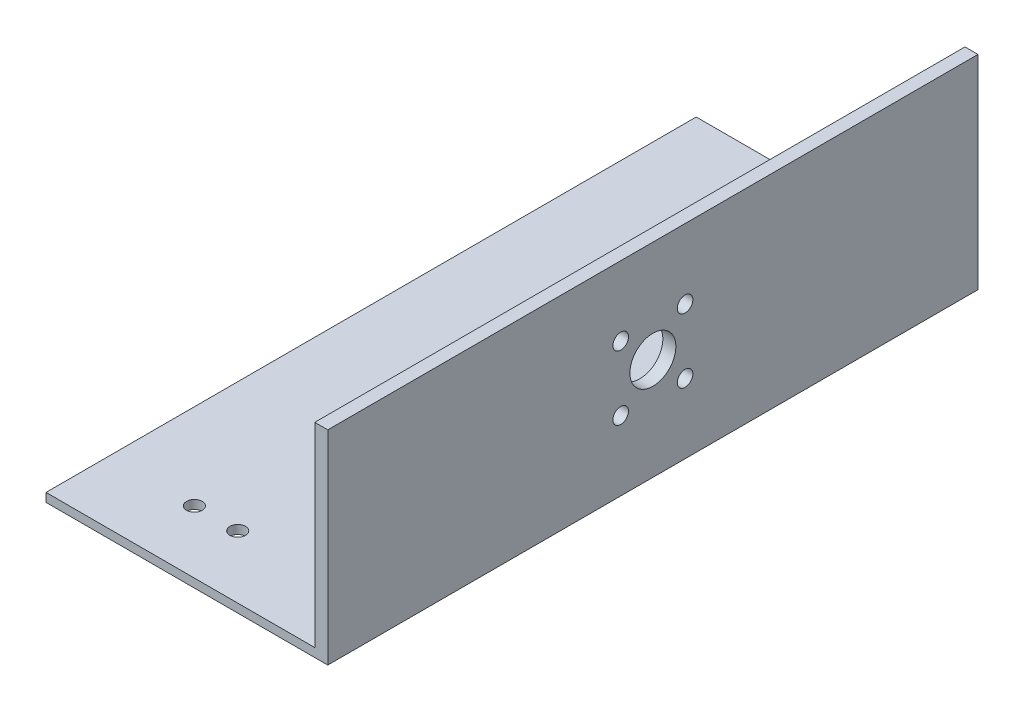
ISO-10303-21;
HEADER;
FILE_DESCRIPTION(('STEP AP214'),'2;1');
FILE_NAME('part.step','',(''),(''),'','','');
FILE_SCHEMA(('AUTOMOTIVE_DESIGN { 1 0 10303 214 1 1 1 1 }'));
ENDSEC;
DATA;
#1=APPLICATION_CONTEXT('core data for automotive mechanical design processes');
#2=APPLICATION_PROTOCOL_DEFINITION('international standard','automotive_design',2000,#1);
#3=PRODUCT_CONTEXT('',#1,'mechanical');
#4=PRODUCT('Part','Part','',(#3));
#5=PRODUCT_RELATED_PRODUCT_CATEGORY('part','',(#4));
#6=PRODUCT_DEFINITION_FORMATION('','',#4);
#7=PRODUCT_DEFINITION_CONTEXT('part definition',#1,'design');
#8=PRODUCT_DEFINITION('design','',#6,#7);
#9=PRODUCT_DEFINITION_SHAPE('','',#8);
#10=(LENGTH_UNIT() NAMED_UNIT(*) SI_UNIT(.MILLI.,.METRE.));
#11=(NAMED_UNIT(*) PLANE_ANGLE_UNIT() SI_UNIT($,.RADIAN.));
#12=(NAMED_UNIT(*) SI_UNIT($,.STERADIAN.) SOLID_ANGLE_UNIT());
#13=UNCERTAINTY_MEASURE_WITH_UNIT(LENGTH_MEASURE(1.E-05),#10,'distance_accuracy_value','');
#14=(GEOMETRIC_REPRESENTATION_CONTEXT(3) GLOBAL_UNCERTAINTY_ASSIGNED_CONTEXT((#13)) GLOBAL_UNIT_ASSIGNED_CONTEXT((#10,
#11,#12)) REPRESENTATION_CONTEXT('',''));
#15=CARTESIAN_POINT('',(0.,0.,0.));
#16=DIRECTION('',(0.,0.,1.));
#17=DIRECTION('',(1.,0.,0.));
#18=AXIS2_PLACEMENT_3D('',#15,#16,#17);
#19=CARTESIAN_POINT('',(0.,2.,0.));
#20=DIRECTION('',(0.,-1.,0.));
#21=DIRECTION('',(0.,0.,-1.));
#22=AXIS2_PLACEMENT_3D('',#19,#20,#21);
#23=PLANE('',#22);
#24=CARTESIAN_POINT('',(-2.69999999999999,2.,12.25));
#25=DIRECTION('',(0.,1.,0.));
#26=DIRECTION('',(0.,0.,-1.));
#27=AXIS2_PLACEMENT_3D('',#24,#25,#26);
#28=CIRCLE('',#27,1.8);
#29=CARTESIAN_POINT('',(-2.69999999999999,2.,10.45));
#30=VERTEX_POINT('',#29);
#31=EDGE_CURVE('E153',#30,#30,#28,.T.);
#32=ORIENTED_EDGE('',*,*,#31,.F.);
#33=EDGE_LOOP('',(#32));
#34=FACE_BOUND('',#33,.T.);
#35=CARTESIAN_POINT('',(-12.7,2.,-60.57));
#36=DIRECTION('',(0.,1.,0.));
#37=DIRECTION('',(0.,0.,1.));
#38=AXIS2_PLACEMENT_3D('',#35,#36,#37);
#39=CIRCLE('',#38,1.8);
#40=CARTESIAN_POINT('',(-12.7,2.,-58.77));
#41=VERTEX_POINT('',#40);
#42=EDGE_CURVE('E141',#41,#41,#39,.T.);
#43=ORIENTED_EDGE('',*,*,#42,.F.);
#44=EDGE_LOOP('',(#43));
#45=FACE_BOUND('',#44,.T.);
#46=CARTESIAN_POINT('',(-12.7,2.,-12.25));
#47=DIRECTION('',(0.,1.,0.));
#48=DIRECTION('',(0.,0.,1.));
#49=AXIS2_PLACEMENT_3D('',#46,#47,#48);
#50=CIRCLE('',#49,1.8);
#51=CARTESIAN_POINT('',(-12.7,2.,-10.45));
#52=VERTEX_POINT('',#51);
#53=EDGE_CURVE('E129',#52,#52,#50,.T.);
#54=ORIENTED_EDGE('',*,*,#53,.F.);
#55=EDGE_LOOP('',(#54));
#56=FACE_BOUND('',#55,.T.);
#57=CARTESIAN_POINT('',(-2.69999999999999,2.,-60.57));
#58=DIRECTION('',(0.,1.,0.));
#59=DIRECTION('',(0.,0.,1.));
#60=AXIS2_PLACEMENT_3D('',#57,#58,#59);
#61=CIRCLE('',#60,1.8);
#62=CARTESIAN_POINT('',(-2.69999999999999,2.,-58.77));
#63=VERTEX_POINT('',#62);
#64=EDGE_CURVE('E118',#63,#63,#61,.T.);
#65=ORIENTED_EDGE('',*,*,#64,.F.);
#66=EDGE_LOOP('',(#65));
#67=FACE_BOUND('',#66,.T.);
#68=CARTESIAN_POINT('',(-2.69999999999999,2.,-12.25));
#69=DIRECTION('',(0.,1.,0.));
#70=DIRECTION('',(0.,0.,1.));
#71=AXIS2_PLACEMENT_3D('',#68,#69,#70);
#72=CIRCLE('',#71,1.8);
#73=CARTESIAN_POINT('',(-2.69999999999999,2.,-10.45));
#74=VERTEX_POINT('',#73);
#75=EDGE_CURVE('E97',#74,#74,#72,.T.);
#76=ORIENTED_EDGE('',*,*,#75,.F.);
#77=EDGE_LOOP('',(#76));
#78=FACE_BOUND('',#77,.T.);
#79=CARTESIAN_POINT('',(-12.7,2.,60.57));
#80=DIRECTION('',(0.,1.,0.));
#81=DIRECTION('',(0.,0.,-1.));
#82=AXIS2_PLACEMENT_3D('',#79,#80,#81);
#83=CIRCLE('',#82,1.8);
#84=CARTESIAN_POINT('',(-12.7,2.,58.77));
#85=VERTEX_POINT('',#84);
#86=EDGE_CURVE('E123',#85,#85,#83,.T.);
#87=ORIENTED_EDGE('',*,*,#86,.F.);
#88=EDGE_LOOP('',(#87));
#89=FACE_BOUND('',#88,.T.);
#90=CARTESIAN_POINT('',(-2.70000000000002,2.,60.57));
#91=DIRECTION('',(0.,1.,0.));
#92=DIRECTION('',(0.,0.,-1.));
#93=AXIS2_PLACEMENT_3D('',#90,#91,#92);
#94=CIRCLE('',#93,1.8);
#95=CARTESIAN_POINT('',(-2.70000000000002,2.,58.77));
#96=VERTEX_POINT('',#95);
#97=EDGE_CURVE('E135',#96,#96,#94,.T.);
#98=ORIENTED_EDGE('',*,*,#97,.F.);
#99=EDGE_LOOP('',(#98));
#100=FACE_BOUND('',#99,.T.);
#101=CARTESIAN_POINT('',(-12.7,2.,12.25));
#102=DIRECTION('',(0.,1.,0.));
#103=DIRECTION('',(0.,0.,-1.));
#104=AXIS2_PLACEMENT_3D('',#101,#102,#103);
#105=CIRCLE('',#104,1.8);
#106=CARTESIAN_POINT('',(-12.7,2.,10.45));
#107=VERTEX_POINT('',#106);
#108=EDGE_CURVE('E147',#107,#107,#105,.T.);
#109=ORIENTED_EDGE('',*,*,#108,.F.);
#110=EDGE_LOOP('',(#109));
#111=FACE_BOUND('',#110,.T.);
#112=DIRECTION('',(0.,0.,1.));
#113=VECTOR('',#112,1.);
#114=CARTESIAN_POINT('',(29.5,2.,-75.));
#115=LINE('',#114,#113);
#116=CARTESIAN_POINT('',(29.5,2.,-75.));
#117=VERTEX_POINT('',#116);
#118=CARTESIAN_POINT('',(29.5,2.,75.));
#119=VERTEX_POINT('',#118);
#120=EDGE_CURVE('E50',#117,#119,#115,.T.);
#121=ORIENTED_EDGE('',*,*,#120,.F.);
#122=DIRECTION('',(-1.,0.,0.));
#123=VECTOR('',#122,1.);
#124=CARTESIAN_POINT('',(32.5,2.,-75.));
#125=LINE('',#124,#123);
#126=CARTESIAN_POINT('',(-32.5,2.,-75.));
#127=VERTEX_POINT('',#126);
#128=EDGE_CURVE('E55',#117,#127,#125,.T.);
#129=ORIENTED_EDGE('',*,*,#128,.T.);
#130=DIRECTION('',(0.,0.,1.));
#131=VECTOR('',#130,1.);
#132=CARTESIAN_POINT('',(-32.5,2.,-75.));
#133=LINE('',#132,#131);
#134=CARTESIAN_POINT('',(-32.5,2.,75.));
#135=VERTEX_POINT('',#134);
#136=EDGE_CURVE('E86',#127,#135,#133,.T.);
#137=ORIENTED_EDGE('',*,*,#136,.T.);
#138=DIRECTION('',(1.,0.,0.));
#139=VECTOR('',#138,1.);
#140=CARTESIAN_POINT('',(32.5,2.,75.));
#141=LINE('',#140,#139);
#142=EDGE_CURVE('E111',#135,#119,#141,.T.);
#143=ORIENTED_EDGE('',*,*,#142,.T.);
#144=EDGE_LOOP('',(#121,#129,#137,#143));
#145=FACE_BOUND('',#144,.T.);
#146=ADVANCED_FACE('F33',(#34,#45,#56,#67,#78,#89,#100,#111,#145),#23,.F.);
#147=CARTESIAN_POINT('',(0.,0.,0.));
#148=DIRECTION('',(0.,-1.,0.));
#149=DIRECTION('',(0.,0.,-1.));
#150=AXIS2_PLACEMENT_3D('',#147,#148,#149);
#151=PLANE('',#150);
#152=CARTESIAN_POINT('',(-12.7,0.,12.25));
#153=DIRECTION('',(0.,1.,0.));
#154=DIRECTION('',(0.,0.,-1.));
#155=AXIS2_PLACEMENT_3D('',#152,#153,#154);
#156=CIRCLE('',#155,1.8);
#157=CARTESIAN_POINT('',(-12.7,0.,10.45));
#158=VERTEX_POINT('',#157);
#159=EDGE_CURVE('E150',#158,#158,#156,.T.);
#160=ORIENTED_EDGE('',*,*,#159,.T.);
#161=EDGE_LOOP('',(#160));
#162=FACE_BOUND('',#161,.T.);
#163=CARTESIAN_POINT('',(-2.70000000000002,0.,60.57));
#164=DIRECTION('',(0.,1.,0.));
#165=DIRECTION('',(0.,0.,-1.));
#166=AXIS2_PLACEMENT_3D('',#163,#164,#165);
#167=CIRCLE('',#166,1.8);
#168=CARTESIAN_POINT('',(-2.70000000000002,0.,58.77));
#169=VERTEX_POINT('',#168);
#170=EDGE_CURVE('E138',#169,#169,#167,.T.);
#171=ORIENTED_EDGE('',*,*,#170,.T.);
#172=EDGE_LOOP('',(#171));
#173=FACE_BOUND('',#172,.T.);
#174=CARTESIAN_POINT('',(-12.7,0.,60.57));
#175=DIRECTION('',(0.,1.,0.));
#176=DIRECTION('',(0.,0.,-1.));
#177=AXIS2_PLACEMENT_3D('',#174,#175,#176);
#178=CIRCLE('',#177,1.8);
#179=CARTESIAN_POINT('',(-12.7,0.,58.77));
#180=VERTEX_POINT('',#179);
#181=EDGE_CURVE('E126',#180,#180,#178,.T.);
#182=ORIENTED_EDGE('',*,*,#181,.T.);
#183=EDGE_LOOP('',(#182));
#184=FACE_BOUND('',#183,.T.);
#185=CARTESIAN_POINT('',(-2.69999999999999,0.,-12.25));
#186=DIRECTION('',(0.,1.,0.));
#187=DIRECTION('',(0.,0.,1.));
#188=AXIS2_PLACEMENT_3D('',#185,#186,#187);
#189=CIRCLE('',#188,1.8);
#190=CARTESIAN_POINT('',(-2.69999999999999,0.,-10.45));
#191=VERTEX_POINT('',#190);
#192=EDGE_CURVE('E101',#191,#191,#189,.T.);
#193=ORIENTED_EDGE('',*,*,#192,.T.);
#194=EDGE_LOOP('',(#193));
#195=FACE_BOUND('',#194,.T.);
#196=DIRECTION('',(0.,0.,1.));
#197=VECTOR('',#196,1.);
#198=CARTESIAN_POINT('',(-32.5,0.,-75.));
#199=LINE('',#198,#197);
#200=CARTESIAN_POINT('',(-32.5,0.,-75.));
#201=VERTEX_POINT('',#200);
#202=CARTESIAN_POINT('',(-32.5,0.,75.));
#203=VERTEX_POINT('',#202);
#204=EDGE_CURVE('E92',#201,#203,#199,.T.);
#205=ORIENTED_EDGE('',*,*,#204,.F.);
#206=DIRECTION('',(-1.,0.,0.));
#207=VECTOR('',#206,1.);
#208=CARTESIAN_POINT('',(32.5,0.,-75.));
#209=LINE('',#208,#207);
#210=CARTESIAN_POINT('',(32.5,0.,-75.));
#211=VERTEX_POINT('',#210);
#212=EDGE_CURVE('E75',#211,#201,#209,.T.);
#213=ORIENTED_EDGE('',*,*,#212,.F.);
#214=DIRECTION('',(0.,0.,-1.));
#215=VECTOR('',#214,1.);
#216=CARTESIAN_POINT('',(32.5,0.,-75.));
#217=LINE('',#216,#215);
#218=CARTESIAN_POINT('',(32.5,0.,75.));
#219=VERTEX_POINT('',#218);
#220=EDGE_CURVE('E87',#219,#211,#217,.T.);
#221=ORIENTED_EDGE('',*,*,#220,.F.);
#222=DIRECTION('',(1.,0.,0.));
#223=VECTOR('',#222,1.);
#224=CARTESIAN_POINT('',(32.5,0.,75.));
#225=LINE('',#224,#223);
#226=EDGE_CURVE('E96',#203,#219,#225,.T.);
#227=ORIENTED_EDGE('',*,*,#226,.F.);
#228=EDGE_LOOP('',(#205,#213,#221,#227));
#229=FACE_BOUND('',#228,.T.);
#230=CARTESIAN_POINT('',(-2.69999999999999,0.,-60.57));
#231=DIRECTION('',(0.,1.,0.));
#232=DIRECTION('',(0.,0.,1.));
#233=AXIS2_PLACEMENT_3D('',#230,#231,#232);
#234=CIRCLE('',#233,1.8);
#235=CARTESIAN_POINT('',(-2.69999999999999,0.,-58.77));
#236=VERTEX_POINT('',#235);
#237=EDGE_CURVE('E120',#236,#236,#234,.T.);
#238=ORIENTED_EDGE('',*,*,#237,.T.);
#239=EDGE_LOOP('',(#238));
#240=FACE_BOUND('',#239,.T.);
#241=CARTESIAN_POINT('',(-12.7,0.,-12.25));
#242=DIRECTION('',(0.,1.,0.));
#243=DIRECTION('',(0.,0.,1.));
#244=AXIS2_PLACEMENT_3D('',#241,#242,#243);
#245=CIRCLE('',#244,1.8);
#246=CARTESIAN_POINT('',(-12.7,0.,-10.45));
#247=VERTEX_POINT('',#246);
#248=EDGE_CURVE('E132',#247,#247,#245,.T.);
#249=ORIENTED_EDGE('',*,*,#248,.T.);
#250=EDGE_LOOP('',(#249));
#251=FACE_BOUND('',#250,.T.);
#252=CARTESIAN_POINT('',(-12.7,0.,-60.57));
#253=DIRECTION('',(0.,1.,0.));
#254=DIRECTION('',(0.,0.,1.));
#255=AXIS2_PLACEMENT_3D('',#252,#253,#254);
#256=CIRCLE('',#255,1.8);
#257=CARTESIAN_POINT('',(-12.7,0.,-58.77));
#258=VERTEX_POINT('',#257);
#259=EDGE_CURVE('E144',#258,#258,#256,.T.);
#260=ORIENTED_EDGE('',*,*,#259,.T.);
#261=EDGE_LOOP('',(#260));
#262=FACE_BOUND('',#261,.T.);
#263=CARTESIAN_POINT('',(-2.69999999999999,0.,12.25));
#264=DIRECTION('',(0.,1.,0.));
#265=DIRECTION('',(0.,0.,-1.));
#266=AXIS2_PLACEMENT_3D('',#263,#264,#265);
#267=CIRCLE('',#266,1.8);
#268=CARTESIAN_POINT('',(-2.69999999999999,0.,10.45));
#269=VERTEX_POINT('',#268);
#270=EDGE_CURVE('E156',#269,#269,#267,.T.);
#271=ORIENTED_EDGE('',*,*,#270,.T.);
#272=EDGE_LOOP('',(#271));
#273=FACE_BOUND('',#272,.T.);
#274=ADVANCED_FACE('F94',(#162,#173,#184,#195,#229,#240,#251,#262,#273),#151,.T.);
#275=CARTESIAN_POINT('',(-32.5,2.,-75.));
#276=DIRECTION('',(1.,0.,0.));
#277=DIRECTION('',(0.,0.,-1.));
#278=AXIS2_PLACEMENT_3D('',#275,#276,#277);
#279=PLANE('',#278);
#280=ORIENTED_EDGE('',*,*,#204,.T.);
#281=DIRECTION('',(0.,-1.,0.));
#282=VECTOR('',#281,1.);
#283=CARTESIAN_POINT('',(-32.5,2.,75.));
#284=LINE('',#283,#282);
#285=EDGE_CURVE('E11',#135,#203,#284,.T.);
#286=ORIENTED_EDGE('',*,*,#285,.F.);
#287=ORIENTED_EDGE('',*,*,#136,.F.);
#288=DIRECTION('',(0.,-1.,0.));
#289=VECTOR('',#288,1.);
#290=CARTESIAN_POINT('',(-32.5,2.,-75.));
#291=LINE('',#290,#289);
#292=EDGE_CURVE('E78',#127,#201,#291,.T.);
#293=ORIENTED_EDGE('',*,*,#292,.T.);
#294=EDGE_LOOP('',(#280,#286,#287,#293));
#295=FACE_BOUND('',#294,.T.);
#296=ADVANCED_FACE('F35',(#295),#279,.F.);
#297=CARTESIAN_POINT('',(32.5,2.,75.));
#298=DIRECTION('',(0.,0.,-1.));
#299=DIRECTION('',(-1.,0.,0.));
#300=AXIS2_PLACEMENT_3D('',#297,#298,#299);
#301=PLANE('',#300);
#302=ORIENTED_EDGE('',*,*,#226,.T.);
#303=DIRECTION('',(0.,-1.,0.));
#304=VECTOR('',#303,1.);
#305=CARTESIAN_POINT('',(32.5,2.,75.));
#306=LINE('',#305,#304);
#307=CARTESIAN_POINT('',(32.5,47.,75.));
#308=VERTEX_POINT('',#307);
#309=EDGE_CURVE('E42',#308,#219,#306,.T.);
#310=ORIENTED_EDGE('',*,*,#309,.F.);
#311=DIRECTION('',(1.,0.,0.));
#312=VECTOR('',#311,1.);
#313=CARTESIAN_POINT('',(32.5,47.,75.));
#314=LINE('',#313,#312);
#315=CARTESIAN_POINT('',(29.5,47.,75.));
#316=VERTEX_POINT('',#315);
#317=EDGE_CURVE('E164',#316,#308,#314,.T.);
#318=ORIENTED_EDGE('',*,*,#317,.F.);
#319=DIRECTION('',(0.,-1.,0.));
#320=VECTOR('',#319,1.);
#321=CARTESIAN_POINT('',(29.5,47.,75.));
#322=LINE('',#321,#320);
#323=EDGE_CURVE('E169',#316,#119,#322,.T.);
#324=ORIENTED_EDGE('',*,*,#323,.T.);
#325=ORIENTED_EDGE('',*,*,#142,.F.);
#326=ORIENTED_EDGE('',*,*,#285,.T.);
#327=EDGE_LOOP('',(#302,#310,#318,#324,#325,#326));
#328=FACE_BOUND('',#327,.T.);
#329=ADVANCED_FACE('F235',(#328),#301,.F.);
#330=CARTESIAN_POINT('',(32.5,2.,-75.));
#331=DIRECTION('',(-1.,0.,0.));
#332=DIRECTION('',(0.,0.,1.));
#333=AXIS2_PLACEMENT_3D('',#330,#331,#332);
#334=PLANE('',#333);
#335=CARTESIAN_POINT('',(32.5,16.0753787975412,-7.42462120245868));
#336=DIRECTION('',(1.,0.,0.));
#337=DIRECTION('',(0.,0.,-1.));
#338=AXIS2_PLACEMENT_3D('',#335,#336,#337);
#339=CIRCLE('',#338,1.8);
#340=CARTESIAN_POINT('',(32.5,16.0753787975412,-9.22462120245868));
#341=VERTEX_POINT('',#340);
#342=EDGE_CURVE('E200',#341,#341,#339,.T.);
#343=ORIENTED_EDGE('',*,*,#342,.F.);
#344=EDGE_LOOP('',(#343));
#345=FACE_BOUND('',#344,.T.);
#346=CARTESIAN_POINT('',(32.5,30.9246212024587,-7.42462120245881));
#347=DIRECTION('',(1.,0.,0.));
#348=DIRECTION('',(0.,0.,-1.));
#349=AXIS2_PLACEMENT_3D('',#346,#347,#348);
#350=CIRCLE('',#349,1.8);
#351=CARTESIAN_POINT('',(32.5,30.9246212024587,-9.22462120245881));
#352=VERTEX_POINT('',#351);
#353=EDGE_CURVE('E190',#352,#352,#350,.T.);
#354=ORIENTED_EDGE('',*,*,#353,.F.);
#355=EDGE_LOOP('',(#354));
#356=FACE_BOUND('',#355,.T.);
#357=CARTESIAN_POINT('',(32.5,30.9246212024588,7.42462120245872));
#358=DIRECTION('',(1.,0.,0.));
#359=DIRECTION('',(0.,0.,-1.));
#360=AXIS2_PLACEMENT_3D('',#357,#358,#359);
#361=CIRCLE('',#360,1.8);
#362=CARTESIAN_POINT('',(32.5,30.9246212024588,5.62462120245872));
#363=VERTEX_POINT('',#362);
#364=EDGE_CURVE('E187',#363,#363,#361,.T.);
#365=ORIENTED_EDGE('',*,*,#364,.F.);
#366=EDGE_LOOP('',(#365));
#367=FACE_BOUND('',#366,.T.);
#368=CARTESIAN_POINT('',(32.5,16.0753787975412,7.42462120245875));
#369=DIRECTION('',(1.,0.,0.));
#370=DIRECTION('',(0.,0.,-1.));
#371=AXIS2_PLACEMENT_3D('',#368,#369,#370);
#372=CIRCLE('',#371,1.8);
#373=CARTESIAN_POINT('',(32.5,16.0753787975412,5.62462120245875));
#374=VERTEX_POINT('',#373);
#375=EDGE_CURVE('E184',#374,#374,#372,.T.);
#376=ORIENTED_EDGE('',*,*,#375,.F.);
#377=EDGE_LOOP('',(#376));
#378=FACE_BOUND('',#377,.T.);
#379=CARTESIAN_POINT('',(32.5,23.5,0.));
#380=DIRECTION('',(1.,0.,0.));
#381=DIRECTION('',(0.,0.,-1.));
#382=AXIS2_PLACEMENT_3D('',#379,#380,#381);
#383=CIRCLE('',#382,5.3);
#384=CARTESIAN_POINT('',(32.5,23.5,-5.3));
#385=VERTEX_POINT('',#384);
#386=EDGE_CURVE('E180',#385,#385,#383,.T.);
#387=ORIENTED_EDGE('',*,*,#386,.F.);
#388=EDGE_LOOP('',(#387));
#389=FACE_BOUND('',#388,.T.);
#390=ORIENTED_EDGE('',*,*,#220,.T.);
#391=DIRECTION('',(0.,-1.,0.));
#392=VECTOR('',#391,1.);
#393=CARTESIAN_POINT('',(32.5,2.,-75.));
#394=LINE('',#393,#392);
#395=CARTESIAN_POINT('',(32.5,47.,-75.));
#396=VERTEX_POINT('',#395);
#397=EDGE_CURVE('E82',#396,#211,#394,.T.);
#398=ORIENTED_EDGE('',*,*,#397,.F.);
#399=DIRECTION('',(0.,0.,-1.));
#400=VECTOR('',#399,1.);
#401=CARTESIAN_POINT('',(32.5,47.,-75.));
#402=LINE('',#401,#400);
#403=EDGE_CURVE('E167',#308,#396,#402,.T.);
#404=ORIENTED_EDGE('',*,*,#403,.F.);
#405=ORIENTED_EDGE('',*,*,#309,.T.);
#406=EDGE_LOOP('',(#390,#398,#404,#405));
#407=FACE_BOUND('',#406,.T.);
#408=ADVANCED_FACE('F226',(#345,#356,#367,#378,#389,#407),#334,.F.);
#409=CARTESIAN_POINT('',(32.5,2.,-75.));
#410=DIRECTION('',(0.,0.,1.));
#411=DIRECTION('',(1.,0.,0.));
#412=AXIS2_PLACEMENT_3D('',#409,#410,#411);
#413=PLANE('',#412);
#414=ORIENTED_EDGE('',*,*,#212,.T.);
#415=ORIENTED_EDGE('',*,*,#292,.F.);
#416=ORIENTED_EDGE('',*,*,#128,.F.);
#417=DIRECTION('',(0.,-1.,0.));
#418=VECTOR('',#417,1.);
#419=CARTESIAN_POINT('',(29.5,47.,-75.));
#420=LINE('',#419,#418);
#421=CARTESIAN_POINT('',(29.5,47.,-75.));
#422=VERTEX_POINT('',#421);
#423=EDGE_CURVE('E159',#422,#117,#420,.T.);
#424=ORIENTED_EDGE('',*,*,#423,.F.);
#425=DIRECTION('',(-1.,0.,0.));
#426=VECTOR('',#425,1.);
#427=CARTESIAN_POINT('',(32.5,47.,-75.));
#428=LINE('',#427,#426);
#429=EDGE_CURVE('E209',#396,#422,#428,.T.);
#430=ORIENTED_EDGE('',*,*,#429,.F.);
#431=ORIENTED_EDGE('',*,*,#397,.T.);
#432=EDGE_LOOP('',(#414,#415,#416,#424,#430,#431));
#433=FACE_BOUND('',#432,.T.);
#434=ADVANCED_FACE('F77',(#433),#413,.F.);
#435=CARTESIAN_POINT('',(-2.69999999999999,2.,-12.25));
#436=DIRECTION('',(0.,-1.,0.));
#437=DIRECTION('',(0.,0.,-1.));
#438=AXIS2_PLACEMENT_3D('',#435,#436,#437);
#439=CYLINDRICAL_SURFACE('',#438,1.8);
#440=ORIENTED_EDGE('',*,*,#75,.T.);
#441=EDGE_LOOP('',(#440));
#442=FACE_BOUND('',#441,.T.);
#443=ORIENTED_EDGE('',*,*,#192,.F.);
#444=EDGE_LOOP('',(#443));
#445=FACE_BOUND('',#444,.T.);
#446=ADVANCED_FACE('F257',(#442,#445),#439,.F.);
#447=CARTESIAN_POINT('',(-2.69999999999999,2.,-60.57));
#448=DIRECTION('',(0.,-1.,0.));
#449=DIRECTION('',(0.,0.,-1.));
#450=AXIS2_PLACEMENT_3D('',#447,#448,#449);
#451=CYLINDRICAL_SURFACE('',#450,1.8);
#452=ORIENTED_EDGE('',*,*,#64,.T.);
#453=EDGE_LOOP('',(#452));
#454=FACE_BOUND('',#453,.T.);
#455=ORIENTED_EDGE('',*,*,#237,.F.);
#456=EDGE_LOOP('',(#455));
#457=FACE_BOUND('',#456,.T.);
#458=ADVANCED_FACE('F265',(#454,#457),#451,.F.);
#459=CARTESIAN_POINT('',(-12.7,2.,60.57));
#460=DIRECTION('',(0.,-1.,0.));
#461=DIRECTION('',(0.,0.,-1.));
#462=AXIS2_PLACEMENT_3D('',#459,#460,#461);
#463=CYLINDRICAL_SURFACE('',#462,1.8);
#464=ORIENTED_EDGE('',*,*,#86,.T.);
#465=EDGE_LOOP('',(#464));
#466=FACE_BOUND('',#465,.T.);
#467=ORIENTED_EDGE('',*,*,#181,.F.);
#468=EDGE_LOOP('',(#467));
#469=FACE_BOUND('',#468,.T.);
#470=ADVANCED_FACE('F270',(#466,#469),#463,.F.);
#471=CARTESIAN_POINT('',(-12.7,2.,-12.25));
#472=DIRECTION('',(0.,-1.,0.));
#473=DIRECTION('',(0.,0.,-1.));
#474=AXIS2_PLACEMENT_3D('',#471,#472,#473);
#475=CYLINDRICAL_SURFACE('',#474,1.8);
#476=ORIENTED_EDGE('',*,*,#53,.T.);
#477=EDGE_LOOP('',(#476));
#478=FACE_BOUND('',#477,.T.);
#479=ORIENTED_EDGE('',*,*,#248,.F.);
#480=EDGE_LOOP('',(#479));
#481=FACE_BOUND('',#480,.T.);
#482=ADVANCED_FACE('F297',(#478,#481),#475,.F.);
#483=CARTESIAN_POINT('',(-2.70000000000002,2.,60.57));
#484=DIRECTION('',(0.,-1.,0.));
#485=DIRECTION('',(0.,0.,-1.));
#486=AXIS2_PLACEMENT_3D('',#483,#484,#485);
#487=CYLINDRICAL_SURFACE('',#486,1.8);
#488=ORIENTED_EDGE('',*,*,#97,.T.);
#489=EDGE_LOOP('',(#488));
#490=FACE_BOUND('',#489,.T.);
#491=ORIENTED_EDGE('',*,*,#170,.F.);
#492=EDGE_LOOP('',(#491));
#493=FACE_BOUND('',#492,.T.);
#494=ADVANCED_FACE('F303',(#490,#493),#487,.F.);
#495=CARTESIAN_POINT('',(-12.7,2.,-60.57));
#496=DIRECTION('',(0.,-1.,0.));
#497=DIRECTION('',(0.,0.,-1.));
#498=AXIS2_PLACEMENT_3D('',#495,#496,#497);
#499=CYLINDRICAL_SURFACE('',#498,1.8);
#500=ORIENTED_EDGE('',*,*,#42,.T.);
#501=EDGE_LOOP('',(#500));
#502=FACE_BOUND('',#501,.T.);
#503=ORIENTED_EDGE('',*,*,#259,.F.);
#504=EDGE_LOOP('',(#503));
#505=FACE_BOUND('',#504,.T.);
#506=ADVANCED_FACE('F288',(#502,#505),#499,.F.);
#507=CARTESIAN_POINT('',(-12.7,2.,12.25));
#508=DIRECTION('',(0.,-1.,0.));
#509=DIRECTION('',(0.,0.,-1.));
#510=AXIS2_PLACEMENT_3D('',#507,#508,#509);
#511=CYLINDRICAL_SURFACE('',#510,1.8);
#512=ORIENTED_EDGE('',*,*,#108,.T.);
#513=EDGE_LOOP('',(#512));
#514=FACE_BOUND('',#513,.T.);
#515=ORIENTED_EDGE('',*,*,#159,.F.);
#516=EDGE_LOOP('',(#515));
#517=FACE_BOUND('',#516,.T.);
#518=ADVANCED_FACE('F284',(#514,#517),#511,.F.);
#519=CARTESIAN_POINT('',(-2.69999999999999,2.,12.25));
#520=DIRECTION('',(0.,-1.,0.));
#521=DIRECTION('',(0.,0.,-1.));
#522=AXIS2_PLACEMENT_3D('',#519,#520,#521);
#523=CYLINDRICAL_SURFACE('',#522,1.8);
#524=ORIENTED_EDGE('',*,*,#31,.T.);
#525=EDGE_LOOP('',(#524));
#526=FACE_BOUND('',#525,.T.);
#527=ORIENTED_EDGE('',*,*,#270,.F.);
#528=EDGE_LOOP('',(#527));
#529=FACE_BOUND('',#528,.T.);
#530=ADVANCED_FACE('F287',(#526,#529),#523,.F.);
#531=CARTESIAN_POINT('',(29.5,47.,-75.));
#532=DIRECTION('',(1.,0.,0.));
#533=DIRECTION('',(0.,0.,-1.));
#534=AXIS2_PLACEMENT_3D('',#531,#532,#533);
#535=PLANE('',#534);
#536=CARTESIAN_POINT('',(29.5,16.0753787975412,-7.42462120245868));
#537=DIRECTION('',(1.,0.,0.));
#538=DIRECTION('',(0.,0.,-1.));
#539=AXIS2_PLACEMENT_3D('',#536,#537,#538);
#540=CIRCLE('',#539,1.8);
#541=CARTESIAN_POINT('',(29.5,16.0753787975412,-9.22462120245868));
#542=VERTEX_POINT('',#541);
#543=EDGE_CURVE('E37',#542,#542,#540,.T.);
#544=ORIENTED_EDGE('',*,*,#543,.T.);
#545=EDGE_LOOP('',(#544));
#546=FACE_BOUND('',#545,.T.);
#547=CARTESIAN_POINT('',(29.5,30.9246212024587,-7.42462120245881));
#548=DIRECTION('',(1.,0.,0.));
#549=DIRECTION('',(0.,0.,-1.));
#550=AXIS2_PLACEMENT_3D('',#547,#548,#549);
#551=CIRCLE('',#550,1.8);
#552=CARTESIAN_POINT('',(29.5,30.9246212024587,-9.22462120245881));
#553=VERTEX_POINT('',#552);
#554=EDGE_CURVE('E188',#553,#553,#551,.T.);
#555=ORIENTED_EDGE('',*,*,#554,.T.);
#556=EDGE_LOOP('',(#555));
#557=FACE_BOUND('',#556,.T.);
#558=CARTESIAN_POINT('',(29.5,30.9246212024588,7.42462120245872));
#559=DIRECTION('',(1.,0.,0.));
#560=DIRECTION('',(0.,0.,-1.));
#561=AXIS2_PLACEMENT_3D('',#558,#559,#560);
#562=CIRCLE('',#561,1.8);
#563=CARTESIAN_POINT('',(29.5,30.9246212024588,5.62462120245872));
#564=VERTEX_POINT('',#563);
#565=EDGE_CURVE('E185',#564,#564,#562,.T.);
#566=ORIENTED_EDGE('',*,*,#565,.T.);
#567=EDGE_LOOP('',(#566));
#568=FACE_BOUND('',#567,.T.);
#569=CARTESIAN_POINT('',(29.5,16.0753787975412,7.42462120245875));
#570=DIRECTION('',(1.,0.,0.));
#571=DIRECTION('',(0.,0.,-1.));
#572=AXIS2_PLACEMENT_3D('',#569,#570,#571);
#573=CIRCLE('',#572,1.8);
#574=CARTESIAN_POINT('',(29.5,16.0753787975412,5.62462120245875));
#575=VERTEX_POINT('',#574);
#576=EDGE_CURVE('E181',#575,#575,#573,.T.);
#577=ORIENTED_EDGE('',*,*,#576,.T.);
#578=EDGE_LOOP('',(#577));
#579=FACE_BOUND('',#578,.T.);
#580=CARTESIAN_POINT('',(29.5,23.5,0.));
#581=DIRECTION('',(1.,0.,0.));
#582=DIRECTION('',(0.,0.,-1.));
#583=AXIS2_PLACEMENT_3D('',#580,#581,#582);
#584=CIRCLE('',#583,5.3);
#585=CARTESIAN_POINT('',(29.5,23.5,-5.3));
#586=VERTEX_POINT('',#585);
#587=EDGE_CURVE('E168',#586,#586,#584,.T.);
#588=ORIENTED_EDGE('',*,*,#587,.T.);
#589=EDGE_LOOP('',(#588));
#590=FACE_BOUND('',#589,.T.);
#591=ORIENTED_EDGE('',*,*,#120,.T.);
#592=ORIENTED_EDGE('',*,*,#323,.F.);
#593=DIRECTION('',(0.,0.,1.));
#594=VECTOR('',#593,1.);
#595=CARTESIAN_POINT('',(29.5,47.,-75.));
#596=LINE('',#595,#594);
#597=EDGE_CURVE('E211',#422,#316,#596,.T.);
#598=ORIENTED_EDGE('',*,*,#597,.F.);
#599=ORIENTED_EDGE('',*,*,#423,.T.);
#600=EDGE_LOOP('',(#591,#592,#598,#599));
#601=FACE_BOUND('',#600,.T.);
#602=ADVANCED_FACE('F234',(#546,#557,#568,#579,#590,#601),#535,.F.);
#603=CARTESIAN_POINT('',(0.,47.,0.));
#604=DIRECTION('',(0.,-1.,0.));
#605=DIRECTION('',(0.,0.,-1.));
#606=AXIS2_PLACEMENT_3D('',#603,#604,#605);
#607=PLANE('',#606);
#608=ORIENTED_EDGE('',*,*,#403,.T.);
#609=ORIENTED_EDGE('',*,*,#429,.T.);
#610=ORIENTED_EDGE('',*,*,#597,.T.);
#611=ORIENTED_EDGE('',*,*,#317,.T.);
#612=EDGE_LOOP('',(#608,#609,#610,#611));
#613=FACE_BOUND('',#612,.T.);
#614=ADVANCED_FACE('F220',(#613),#607,.F.);
#615=CARTESIAN_POINT('',(22.5,23.5,0.));
#616=DIRECTION('',(1.,0.,0.));
#617=DIRECTION('',(0.,0.,-1.));
#618=AXIS2_PLACEMENT_3D('',#615,#616,#617);
#619=CYLINDRICAL_SURFACE('',#618,5.3);
#620=ORIENTED_EDGE('',*,*,#386,.T.);
#621=EDGE_LOOP('',(#620));
#622=FACE_BOUND('',#621,.T.);
#623=ORIENTED_EDGE('',*,*,#587,.F.);
#624=EDGE_LOOP('',(#623));
#625=FACE_BOUND('',#624,.T.);
#626=ADVANCED_FACE('F321',(#622,#625),#619,.F.);
#627=CARTESIAN_POINT('',(22.5,16.0753787975412,7.42462120245875));
#628=DIRECTION('',(1.,0.,0.));
#629=DIRECTION('',(0.,0.,-1.));
#630=AXIS2_PLACEMENT_3D('',#627,#628,#629);
#631=CYLINDRICAL_SURFACE('',#630,1.8);
#632=ORIENTED_EDGE('',*,*,#375,.T.);
#633=EDGE_LOOP('',(#632));
#634=FACE_BOUND('',#633,.T.);
#635=ORIENTED_EDGE('',*,*,#576,.F.);
#636=EDGE_LOOP('',(#635));
#637=FACE_BOUND('',#636,.T.);
#638=ADVANCED_FACE('F324',(#634,#637),#631,.F.);
#639=CARTESIAN_POINT('',(22.5,30.9246212024588,7.42462120245872));
#640=DIRECTION('',(1.,0.,0.));
#641=DIRECTION('',(0.,0.,-1.));
#642=AXIS2_PLACEMENT_3D('',#639,#640,#641);
#643=CYLINDRICAL_SURFACE('',#642,1.8);
#644=ORIENTED_EDGE('',*,*,#364,.T.);
#645=EDGE_LOOP('',(#644));
#646=FACE_BOUND('',#645,.T.);
#647=ORIENTED_EDGE('',*,*,#565,.F.);
#648=EDGE_LOOP('',(#647));
#649=FACE_BOUND('',#648,.T.);
#650=ADVANCED_FACE('F328',(#646,#649),#643,.F.);
#651=CARTESIAN_POINT('',(22.5,30.9246212024587,-7.42462120245881));
#652=DIRECTION('',(1.,0.,0.));
#653=DIRECTION('',(0.,0.,-1.));
#654=AXIS2_PLACEMENT_3D('',#651,#652,#653);
#655=CYLINDRICAL_SURFACE('',#654,1.8);
#656=ORIENTED_EDGE('',*,*,#353,.T.);
#657=EDGE_LOOP('',(#656));
#658=FACE_BOUND('',#657,.T.);
#659=ORIENTED_EDGE('',*,*,#554,.F.);
#660=EDGE_LOOP('',(#659));
#661=FACE_BOUND('',#660,.T.);
#662=ADVANCED_FACE('F332',(#658,#661),#655,.F.);
#663=CARTESIAN_POINT('',(22.5,16.0753787975412,-7.42462120245868));
#664=DIRECTION('',(1.,0.,0.));
#665=DIRECTION('',(0.,0.,-1.));
#666=AXIS2_PLACEMENT_3D('',#663,#664,#665);
#667=CYLINDRICAL_SURFACE('',#666,1.8);
#668=ORIENTED_EDGE('',*,*,#342,.T.);
#669=EDGE_LOOP('',(#668));
#670=FACE_BOUND('',#669,.T.);
#671=ORIENTED_EDGE('',*,*,#543,.F.);
#672=EDGE_LOOP('',(#671));
#673=FACE_BOUND('',#672,.T.);
#674=ADVANCED_FACE('F336',(#670,#673),#667,.F.);
#675=CLOSED_SHELL('',(#146,#274,#296,#329,#408,#434,#446,#458,#470,#482,#494,#506,#518,#530,
#602,#614,#626,#638,#650,#662,#674));
#676=MANIFOLD_SOLID_BREP('B2',#675);
#677=ADVANCED_BREP_SHAPE_REPRESENTATION('',(#18,#676),#14);
#678=SHAPE_DEFINITION_REPRESENTATION(#9,#677);
ENDSEC;
END-ISO-10303-21;
